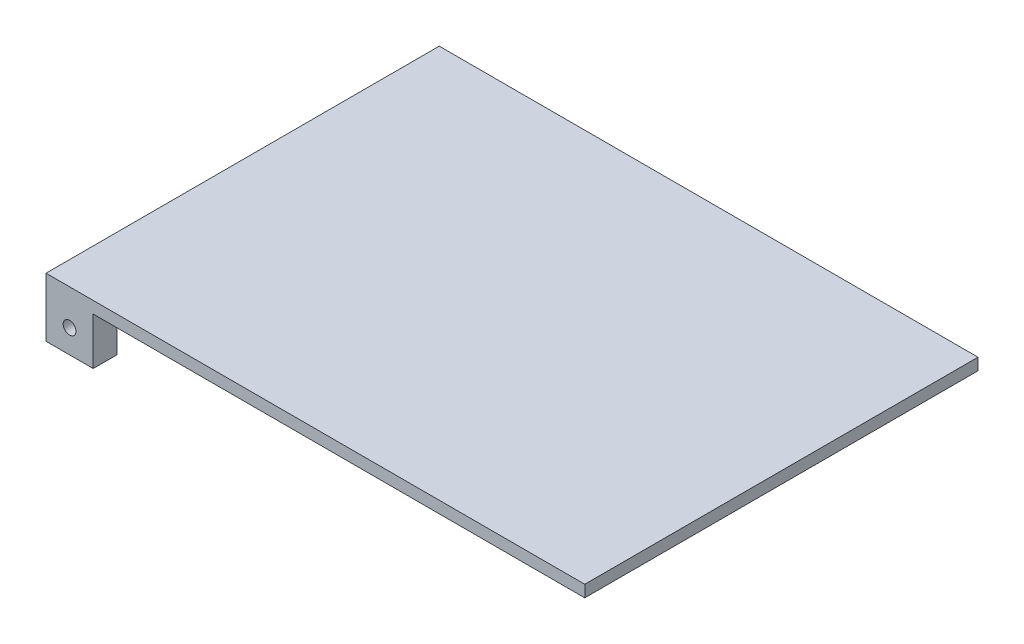
ISO-10303-21;
HEADER;
FILE_DESCRIPTION(('STEP AP214'),'2;1');
FILE_NAME('part.step','',(''),(''),'','','');
FILE_SCHEMA(('AUTOMOTIVE_DESIGN { 1 0 10303 214 1 1 1 1 }'));
ENDSEC;
DATA;
#1=APPLICATION_CONTEXT('core data for automotive mechanical design processes');
#2=APPLICATION_PROTOCOL_DEFINITION('international standard','automotive_design',2000,#1);
#3=PRODUCT_CONTEXT('',#1,'mechanical');
#4=PRODUCT('Part','Part','',(#3));
#5=PRODUCT_RELATED_PRODUCT_CATEGORY('part','',(#4));
#6=PRODUCT_DEFINITION_FORMATION('','',#4);
#7=PRODUCT_DEFINITION_CONTEXT('part definition',#1,'design');
#8=PRODUCT_DEFINITION('design','',#6,#7);
#9=PRODUCT_DEFINITION_SHAPE('','',#8);
#10=(LENGTH_UNIT() NAMED_UNIT(*) SI_UNIT(.MILLI.,.METRE.));
#11=(NAMED_UNIT(*) PLANE_ANGLE_UNIT() SI_UNIT($,.RADIAN.));
#12=(NAMED_UNIT(*) SI_UNIT($,.STERADIAN.) SOLID_ANGLE_UNIT());
#13=UNCERTAINTY_MEASURE_WITH_UNIT(LENGTH_MEASURE(1.E-05),#10,'distance_accuracy_value','');
#14=(GEOMETRIC_REPRESENTATION_CONTEXT(3) GLOBAL_UNCERTAINTY_ASSIGNED_CONTEXT((#13)) GLOBAL_UNIT_ASSIGNED_CONTEXT((#10,
#11,#12)) REPRESENTATION_CONTEXT('',''));
#15=CARTESIAN_POINT('',(0.,0.,0.));
#16=DIRECTION('',(0.,0.,1.));
#17=DIRECTION('',(1.,0.,0.));
#18=AXIS2_PLACEMENT_3D('',#15,#16,#17);
#19=CARTESIAN_POINT('',(0.,0.,0.));
#20=DIRECTION('',(0.,-1.,0.));
#21=DIRECTION('',(0.,0.,-1.));
#22=AXIS2_PLACEMENT_3D('',#19,#20,#21);
#23=PLANE('',#22);
#24=DIRECTION('',(0.,0.,-1.));
#25=VECTOR('',#24,1.);
#26=CARTESIAN_POINT('',(137.,0.,0.));
#27=LINE('',#26,#25);
#28=CARTESIAN_POINT('',(137.,0.,0.));
#29=VERTEX_POINT('',#28);
#30=CARTESIAN_POINT('',(137.,0.,-100.));
#31=VERTEX_POINT('',#30);
#32=EDGE_CURVE('E129',#29,#31,#27,.T.);
#33=ORIENTED_EDGE('',*,*,#32,.F.);
#34=DIRECTION('',(1.,0.,0.));
#35=VECTOR('',#34,1.);
#36=CARTESIAN_POINT('',(0.,0.,0.));
#37=LINE('',#36,#35);
#38=CARTESIAN_POINT('',(12.,0.,0.));
#39=VERTEX_POINT('',#38);
#40=EDGE_CURVE('E63',#39,#29,#37,.T.);
#41=ORIENTED_EDGE('',*,*,#40,.F.);
#42=DIRECTION('',(0.,0.,1.));
#43=VECTOR('',#42,1.);
#44=CARTESIAN_POINT('',(12.,0.,0.));
#45=LINE('',#44,#43);
#46=CARTESIAN_POINT('',(12.,0.,-6.));
#47=VERTEX_POINT('',#46);
#48=EDGE_CURVE('E207',#47,#39,#45,.T.);
#49=ORIENTED_EDGE('',*,*,#48,.F.);
#50=DIRECTION('',(1.,0.,0.));
#51=VECTOR('',#50,1.);
#52=CARTESIAN_POINT('',(0.,0.,-6.));
#53=LINE('',#52,#51);
#54=CARTESIAN_POINT('',(0.,0.,-6.));
#55=VERTEX_POINT('',#54);
#56=EDGE_CURVE('E201',#55,#47,#53,.T.);
#57=ORIENTED_EDGE('',*,*,#56,.F.);
#58=DIRECTION('',(0.,0.,1.));
#59=VECTOR('',#58,1.);
#60=CARTESIAN_POINT('',(0.,0.,0.));
#61=LINE('',#60,#59);
#62=CARTESIAN_POINT('',(0.,0.,-94.));
#63=VERTEX_POINT('',#62);
#64=EDGE_CURVE('E145',#63,#55,#61,.T.);
#65=ORIENTED_EDGE('',*,*,#64,.F.);
#66=DIRECTION('',(-1.,0.,0.));
#67=VECTOR('',#66,1.);
#68=CARTESIAN_POINT('',(0.,0.,-94.));
#69=LINE('',#68,#67);
#70=CARTESIAN_POINT('',(12.,0.,-94.));
#71=VERTEX_POINT('',#70);
#72=EDGE_CURVE('E177',#71,#63,#69,.T.);
#73=ORIENTED_EDGE('',*,*,#72,.F.);
#74=DIRECTION('',(0.,0.,1.));
#75=VECTOR('',#74,1.);
#76=CARTESIAN_POINT('',(12.,0.,-100.));
#77=LINE('',#76,#75);
#78=CARTESIAN_POINT('',(12.,0.,-100.));
#79=VERTEX_POINT('',#78);
#80=EDGE_CURVE('E180',#79,#71,#77,.T.);
#81=ORIENTED_EDGE('',*,*,#80,.F.);
#82=DIRECTION('',(-1.,0.,0.));
#83=VECTOR('',#82,1.);
#84=CARTESIAN_POINT('',(0.,0.,-100.));
#85=LINE('',#84,#83);
#86=EDGE_CURVE('E141',#31,#79,#85,.T.);
#87=ORIENTED_EDGE('',*,*,#86,.F.);
#88=EDGE_LOOP('',(#33,#41,#49,#57,#65,#73,#81,#87));
#89=FACE_BOUND('',#88,.T.);
#90=ADVANCED_FACE('F38',(#89),#23,.T.);
#91=CARTESIAN_POINT('',(0.,3.,0.));
#92=DIRECTION('',(1.,0.,0.));
#93=DIRECTION('',(0.,0.,-1.));
#94=AXIS2_PLACEMENT_3D('',#91,#92,#93);
#95=PLANE('',#94);
#96=DIRECTION('',(0.,-1.,0.));
#97=VECTOR('',#96,1.);
#98=CARTESIAN_POINT('',(0.,3.,-100.));
#99=LINE('',#98,#97);
#100=CARTESIAN_POINT('',(0.,3.,-100.));
#101=VERTEX_POINT('',#100);
#102=CARTESIAN_POINT('',(0.,-12.,-100.));
#103=VERTEX_POINT('',#102);
#104=EDGE_CURVE('E48',#101,#103,#99,.T.);
#105=ORIENTED_EDGE('',*,*,#104,.T.);
#106=DIRECTION('',(0.,0.,-1.));
#107=VECTOR('',#106,1.);
#108=CARTESIAN_POINT('',(0.,-12.,-100.));
#109=LINE('',#108,#107);
#110=CARTESIAN_POINT('',(0.,-12.,-94.));
#111=VERTEX_POINT('',#110);
#112=EDGE_CURVE('E160',#111,#103,#109,.T.);
#113=ORIENTED_EDGE('',*,*,#112,.F.);
#114=DIRECTION('',(0.,1.,0.));
#115=VECTOR('',#114,1.);
#116=CARTESIAN_POINT('',(0.,-12.,-94.));
#117=LINE('',#116,#115);
#118=EDGE_CURVE('E190',#111,#63,#117,.T.);
#119=ORIENTED_EDGE('',*,*,#118,.T.);
#120=ORIENTED_EDGE('',*,*,#64,.T.);
#121=DIRECTION('',(0.,1.,0.));
#122=VECTOR('',#121,1.);
#123=CARTESIAN_POINT('',(0.,-12.,-6.));
#124=LINE('',#123,#122);
#125=CARTESIAN_POINT('',(0.,-12.,-6.));
#126=VERTEX_POINT('',#125);
#127=EDGE_CURVE('E148',#126,#55,#124,.T.);
#128=ORIENTED_EDGE('',*,*,#127,.F.);
#129=DIRECTION('',(0.,0.,-1.));
#130=VECTOR('',#129,1.);
#131=CARTESIAN_POINT('',(0.,-12.,0.));
#132=LINE('',#131,#130);
#133=CARTESIAN_POINT('',(0.,-12.,0.));
#134=VERTEX_POINT('',#133);
#135=EDGE_CURVE('E202',#134,#126,#132,.T.);
#136=ORIENTED_EDGE('',*,*,#135,.F.);
#137=DIRECTION('',(0.,-1.,0.));
#138=VECTOR('',#137,1.);
#139=CARTESIAN_POINT('',(0.,3.,0.));
#140=LINE('',#139,#138);
#141=CARTESIAN_POINT('',(0.,3.,0.));
#142=VERTEX_POINT('',#141);
#143=EDGE_CURVE('E11',#142,#134,#140,.T.);
#144=ORIENTED_EDGE('',*,*,#143,.F.);
#145=DIRECTION('',(0.,0.,1.));
#146=VECTOR('',#145,1.);
#147=CARTESIAN_POINT('',(0.,3.,0.));
#148=LINE('',#147,#146);
#149=EDGE_CURVE('E133',#101,#142,#148,.T.);
#150=ORIENTED_EDGE('',*,*,#149,.F.);
#151=EDGE_LOOP('',(#105,#113,#119,#120,#128,#136,#144,#150));
#152=FACE_BOUND('',#151,.T.);
#153=ADVANCED_FACE('F40',(#152),#95,.F.);
#154=CARTESIAN_POINT('',(0.,3.,0.));
#155=DIRECTION('',(0.,0.,-1.));
#156=DIRECTION('',(-1.,0.,0.));
#157=AXIS2_PLACEMENT_3D('',#154,#155,#156);
#158=PLANE('',#157);
#159=CARTESIAN_POINT('',(6.,-6.,0.));
#160=DIRECTION('',(0.,0.,1.));
#161=DIRECTION('',(1.,0.,0.));
#162=AXIS2_PLACEMENT_3D('',#159,#160,#161);
#163=CIRCLE('',#162,1.625);
#164=CARTESIAN_POINT('',(7.625,-6.,0.));
#165=VERTEX_POINT('',#164);
#166=EDGE_CURVE('E273',#165,#165,#163,.T.);
#167=ORIENTED_EDGE('',*,*,#166,.F.);
#168=EDGE_LOOP('',(#167));
#169=FACE_BOUND('',#168,.T.);
#170=ORIENTED_EDGE('',*,*,#40,.T.);
#171=DIRECTION('',(0.,1.,0.));
#172=VECTOR('',#171,1.);
#173=CARTESIAN_POINT('',(137.,-12.,0.));
#174=LINE('',#173,#172);
#175=CARTESIAN_POINT('',(137.,3.,0.));
#176=VERTEX_POINT('',#175);
#177=EDGE_CURVE('E117',#29,#176,#174,.T.);
#178=ORIENTED_EDGE('',*,*,#177,.T.);
#179=DIRECTION('',(1.,0.,0.));
#180=VECTOR('',#179,1.);
#181=CARTESIAN_POINT('',(0.,3.,0.));
#182=LINE('',#181,#180);
#183=EDGE_CURVE('E125',#142,#176,#182,.T.);
#184=ORIENTED_EDGE('',*,*,#183,.F.);
#185=ORIENTED_EDGE('',*,*,#143,.T.);
#186=DIRECTION('',(-1.,0.,0.));
#187=VECTOR('',#186,1.);
#188=CARTESIAN_POINT('',(0.,-12.,0.));
#189=LINE('',#188,#187);
#190=CARTESIAN_POINT('',(12.,-12.,0.));
#191=VERTEX_POINT('',#190);
#192=EDGE_CURVE('E213',#191,#134,#189,.T.);
#193=ORIENTED_EDGE('',*,*,#192,.F.);
#194=DIRECTION('',(0.,1.,0.));
#195=VECTOR('',#194,1.);
#196=CARTESIAN_POINT('',(12.,-12.,0.));
#197=LINE('',#196,#195);
#198=EDGE_CURVE('E217',#191,#39,#197,.T.);
#199=ORIENTED_EDGE('',*,*,#198,.T.);
#200=EDGE_LOOP('',(#170,#178,#184,#185,#193,#199));
#201=FACE_BOUND('',#200,.T.);
#202=ADVANCED_FACE('F124',(#169,#201),#158,.F.);
#203=CARTESIAN_POINT('',(0.,3.,-100.));
#204=DIRECTION('',(0.,0.,1.));
#205=DIRECTION('',(1.,0.,0.));
#206=AXIS2_PLACEMENT_3D('',#203,#204,#205);
#207=PLANE('',#206);
#208=CARTESIAN_POINT('',(6.,-6.,-100.));
#209=DIRECTION('',(0.,0.,1.));
#210=DIRECTION('',(1.,0.,0.));
#211=AXIS2_PLACEMENT_3D('',#208,#209,#210);
#212=CIRCLE('',#211,1.625);
#213=CARTESIAN_POINT('',(7.625,-6.,-100.));
#214=VERTEX_POINT('',#213);
#215=EDGE_CURVE('E276',#214,#214,#212,.T.);
#216=ORIENTED_EDGE('',*,*,#215,.T.);
#217=EDGE_LOOP('',(#216));
#218=FACE_BOUND('',#217,.T.);
#219=DIRECTION('',(-1.,0.,0.));
#220=VECTOR('',#219,1.);
#221=CARTESIAN_POINT('',(0.,3.,-100.));
#222=LINE('',#221,#220);
#223=CARTESIAN_POINT('',(137.,3.,-100.));
#224=VERTEX_POINT('',#223);
#225=EDGE_CURVE('E136',#224,#101,#222,.T.);
#226=ORIENTED_EDGE('',*,*,#225,.F.);
#227=DIRECTION('',(0.,1.,0.));
#228=VECTOR('',#227,1.);
#229=CARTESIAN_POINT('',(137.,-12.,-100.));
#230=LINE('',#229,#228);
#231=EDGE_CURVE('E55',#31,#224,#230,.T.);
#232=ORIENTED_EDGE('',*,*,#231,.F.);
#233=ORIENTED_EDGE('',*,*,#86,.T.);
#234=DIRECTION('',(0.,1.,0.));
#235=VECTOR('',#234,1.);
#236=CARTESIAN_POINT('',(12.,-12.,-100.));
#237=LINE('',#236,#235);
#238=CARTESIAN_POINT('',(12.,-12.,-100.));
#239=VERTEX_POINT('',#238);
#240=EDGE_CURVE('E166',#239,#79,#237,.T.);
#241=ORIENTED_EDGE('',*,*,#240,.F.);
#242=DIRECTION('',(1.,0.,0.));
#243=VECTOR('',#242,1.);
#244=CARTESIAN_POINT('',(0.,-12.,-100.));
#245=LINE('',#244,#243);
#246=EDGE_CURVE('E163',#103,#239,#245,.T.);
#247=ORIENTED_EDGE('',*,*,#246,.F.);
#248=ORIENTED_EDGE('',*,*,#104,.F.);
#249=EDGE_LOOP('',(#226,#232,#233,#241,#247,#248));
#250=FACE_BOUND('',#249,.T.);
#251=ADVANCED_FACE('F164',(#218,#250),#207,.F.);
#252=CARTESIAN_POINT('',(0.,3.,0.));
#253=DIRECTION('',(0.,-1.,0.));
#254=DIRECTION('',(0.,0.,-1.));
#255=AXIS2_PLACEMENT_3D('',#252,#253,#254);
#256=PLANE('',#255);
#257=ORIENTED_EDGE('',*,*,#183,.T.);
#258=DIRECTION('',(0.,0.,1.));
#259=VECTOR('',#258,1.);
#260=CARTESIAN_POINT('',(137.,3.,0.));
#261=LINE('',#260,#259);
#262=EDGE_CURVE('E114',#224,#176,#261,.T.);
#263=ORIENTED_EDGE('',*,*,#262,.F.);
#264=ORIENTED_EDGE('',*,*,#225,.T.);
#265=ORIENTED_EDGE('',*,*,#149,.T.);
#266=EDGE_LOOP('',(#257,#263,#264,#265));
#267=FACE_BOUND('',#266,.T.);
#268=ADVANCED_FACE('F131',(#267),#256,.F.);
#269=CARTESIAN_POINT('',(0.,-12.,-6.));
#270=DIRECTION('',(0.,0.,1.));
#271=DIRECTION('',(1.,0.,0.));
#272=AXIS2_PLACEMENT_3D('',#269,#270,#271);
#273=PLANE('',#272);
#274=CARTESIAN_POINT('',(6.,-6.,-6.00000000000001));
#275=DIRECTION('',(0.,0.,1.));
#276=DIRECTION('',(1.,0.,0.));
#277=AXIS2_PLACEMENT_3D('',#274,#275,#276);
#278=CIRCLE('',#277,1.625);
#279=CARTESIAN_POINT('',(7.625,-6.,-6.00000000000001));
#280=VERTEX_POINT('',#279);
#281=EDGE_CURVE('E183',#280,#280,#278,.T.);
#282=ORIENTED_EDGE('',*,*,#281,.T.);
#283=EDGE_LOOP('',(#282));
#284=FACE_BOUND('',#283,.T.);
#285=ORIENTED_EDGE('',*,*,#56,.T.);
#286=DIRECTION('',(0.,1.,0.));
#287=VECTOR('',#286,1.);
#288=CARTESIAN_POINT('',(12.,-12.,-6.));
#289=LINE('',#288,#287);
#290=CARTESIAN_POINT('',(12.,-12.,-6.));
#291=VERTEX_POINT('',#290);
#292=EDGE_CURVE('E225',#291,#47,#289,.T.);
#293=ORIENTED_EDGE('',*,*,#292,.F.);
#294=DIRECTION('',(1.,0.,0.));
#295=VECTOR('',#294,1.);
#296=CARTESIAN_POINT('',(0.,-12.,-6.));
#297=LINE('',#296,#295);
#298=EDGE_CURVE('E206',#126,#291,#297,.T.);
#299=ORIENTED_EDGE('',*,*,#298,.F.);
#300=ORIENTED_EDGE('',*,*,#127,.T.);
#301=EDGE_LOOP('',(#285,#293,#299,#300));
#302=FACE_BOUND('',#301,.T.);
#303=ADVANCED_FACE('F232',(#284,#302),#273,.F.);
#304=CARTESIAN_POINT('',(12.,-12.,0.));
#305=DIRECTION('',(-1.,0.,0.));
#306=DIRECTION('',(0.,0.,1.));
#307=AXIS2_PLACEMENT_3D('',#304,#305,#306);
#308=PLANE('',#307);
#309=ORIENTED_EDGE('',*,*,#48,.T.);
#310=ORIENTED_EDGE('',*,*,#198,.F.);
#311=DIRECTION('',(0.,0.,1.));
#312=VECTOR('',#311,1.);
#313=CARTESIAN_POINT('',(12.,-12.,0.));
#314=LINE('',#313,#312);
#315=EDGE_CURVE('E210',#291,#191,#314,.T.);
#316=ORIENTED_EDGE('',*,*,#315,.F.);
#317=ORIENTED_EDGE('',*,*,#292,.T.);
#318=EDGE_LOOP('',(#309,#310,#316,#317));
#319=FACE_BOUND('',#318,.T.);
#320=ADVANCED_FACE('F240',(#319),#308,.F.);
#321=CARTESIAN_POINT('',(0.,-12.,0.));
#322=DIRECTION('',(0.,-1.,0.));
#323=DIRECTION('',(0.,0.,-1.));
#324=AXIS2_PLACEMENT_3D('',#321,#322,#323);
#325=PLANE('',#324);
#326=ORIENTED_EDGE('',*,*,#135,.T.);
#327=ORIENTED_EDGE('',*,*,#298,.T.);
#328=ORIENTED_EDGE('',*,*,#315,.T.);
#329=ORIENTED_EDGE('',*,*,#192,.T.);
#330=EDGE_LOOP('',(#326,#327,#328,#329));
#331=FACE_BOUND('',#330,.T.);
#332=ADVANCED_FACE('F244',(#331),#325,.T.);
#333=CARTESIAN_POINT('',(12.,-12.,-100.));
#334=DIRECTION('',(-1.,0.,0.));
#335=DIRECTION('',(0.,0.,1.));
#336=AXIS2_PLACEMENT_3D('',#333,#334,#335);
#337=PLANE('',#336);
#338=ORIENTED_EDGE('',*,*,#80,.T.);
#339=DIRECTION('',(0.,1.,0.));
#340=VECTOR('',#339,1.);
#341=CARTESIAN_POINT('',(12.,-12.,-94.));
#342=LINE('',#341,#340);
#343=CARTESIAN_POINT('',(12.,-12.,-94.));
#344=VERTEX_POINT('',#343);
#345=EDGE_CURVE('E195',#344,#71,#342,.T.);
#346=ORIENTED_EDGE('',*,*,#345,.F.);
#347=DIRECTION('',(0.,0.,1.));
#348=VECTOR('',#347,1.);
#349=CARTESIAN_POINT('',(12.,-12.,-100.));
#350=LINE('',#349,#348);
#351=EDGE_CURVE('E170',#239,#344,#350,.T.);
#352=ORIENTED_EDGE('',*,*,#351,.F.);
#353=ORIENTED_EDGE('',*,*,#240,.T.);
#354=EDGE_LOOP('',(#338,#346,#352,#353));
#355=FACE_BOUND('',#354,.T.);
#356=ADVANCED_FACE('F246',(#355),#337,.F.);
#357=CARTESIAN_POINT('',(0.,-12.,-94.));
#358=DIRECTION('',(0.,0.,-1.));
#359=DIRECTION('',(-1.,0.,0.));
#360=AXIS2_PLACEMENT_3D('',#357,#358,#359);
#361=PLANE('',#360);
#362=CARTESIAN_POINT('',(6.,-6.,-94.));
#363=DIRECTION('',(0.,0.,-1.));
#364=DIRECTION('',(-1.,0.,0.));
#365=AXIS2_PLACEMENT_3D('',#362,#363,#364);
#366=CIRCLE('',#365,1.625);
#367=CARTESIAN_POINT('',(4.375,-6.,-94.));
#368=VERTEX_POINT('',#367);
#369=EDGE_CURVE('E42',#368,#368,#366,.T.);
#370=ORIENTED_EDGE('',*,*,#369,.T.);
#371=EDGE_LOOP('',(#370));
#372=FACE_BOUND('',#371,.T.);
#373=ORIENTED_EDGE('',*,*,#72,.T.);
#374=ORIENTED_EDGE('',*,*,#118,.F.);
#375=DIRECTION('',(-1.,0.,0.));
#376=VECTOR('',#375,1.);
#377=CARTESIAN_POINT('',(0.,-12.,-94.));
#378=LINE('',#377,#376);
#379=EDGE_CURVE('E174',#344,#111,#378,.T.);
#380=ORIENTED_EDGE('',*,*,#379,.F.);
#381=ORIENTED_EDGE('',*,*,#345,.T.);
#382=EDGE_LOOP('',(#373,#374,#380,#381));
#383=FACE_BOUND('',#382,.T.);
#384=ADVANCED_FACE('F252',(#372,#383),#361,.F.);
#385=CARTESIAN_POINT('',(0.,-12.,0.));
#386=DIRECTION('',(0.,1.,0.));
#387=DIRECTION('',(0.,0.,1.));
#388=AXIS2_PLACEMENT_3D('',#385,#386,#387);
#389=PLANE('',#388);
#390=ORIENTED_EDGE('',*,*,#112,.T.);
#391=ORIENTED_EDGE('',*,*,#246,.T.);
#392=ORIENTED_EDGE('',*,*,#351,.T.);
#393=ORIENTED_EDGE('',*,*,#379,.T.);
#394=EDGE_LOOP('',(#390,#391,#392,#393));
#395=FACE_BOUND('',#394,.T.);
#396=ADVANCED_FACE('F172',(#395),#389,.F.);
#397=CARTESIAN_POINT('',(6.,-6.,-100.));
#398=DIRECTION('',(0.,0.,1.));
#399=DIRECTION('',(1.,0.,0.));
#400=AXIS2_PLACEMENT_3D('',#397,#398,#399);
#401=CYLINDRICAL_SURFACE('',#400,1.625);
#402=ORIENTED_EDGE('',*,*,#215,.F.);
#403=EDGE_LOOP('',(#402));
#404=FACE_BOUND('',#403,.T.);
#405=ORIENTED_EDGE('',*,*,#369,.F.);
#406=EDGE_LOOP('',(#405));
#407=FACE_BOUND('',#406,.T.);
#408=ADVANCED_FACE('F294',(#404,#407),#401,.F.);
#409=ORIENTED_EDGE('',*,*,#166,.T.);
#410=EDGE_LOOP('',(#409));
#411=FACE_BOUND('',#410,.T.);
#412=ORIENTED_EDGE('',*,*,#281,.F.);
#413=EDGE_LOOP('',(#412));
#414=FACE_BOUND('',#413,.T.);
#415=ADVANCED_FACE('F298',(#411,#414),#401,.F.);
#416=CARTESIAN_POINT('',(137.,-12.,0.));
#417=DIRECTION('',(-1.,0.,0.));
#418=DIRECTION('',(0.,0.,1.));
#419=AXIS2_PLACEMENT_3D('',#416,#417,#418);
#420=PLANE('',#419);
#421=ORIENTED_EDGE('',*,*,#32,.T.);
#422=ORIENTED_EDGE('',*,*,#231,.T.);
#423=ORIENTED_EDGE('',*,*,#262,.T.);
#424=ORIENTED_EDGE('',*,*,#177,.F.);
#425=EDGE_LOOP('',(#421,#422,#423,#424));
#426=FACE_BOUND('',#425,.T.);
#427=ADVANCED_FACE('F116',(#426),#420,.F.);
#428=CLOSED_SHELL('',(#90,#153,#202,#251,#268,#303,#320,#332,#356,#384,#396,#408,#415,#427));
#429=MANIFOLD_SOLID_BREP('B2',#428);
#430=ADVANCED_BREP_SHAPE_REPRESENTATION('',(#18,#429),#14);
#431=SHAPE_DEFINITION_REPRESENTATION(#9,#430);
ENDSEC;
END-ISO-10303-21;
